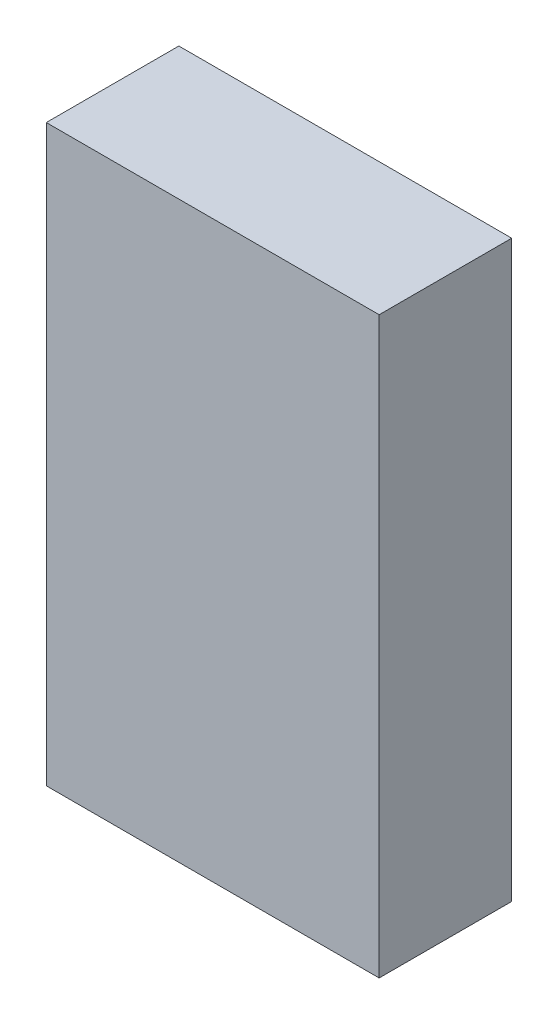
ISO-10303-21;
HEADER;
FILE_DESCRIPTION(('STEP AP214'),'2;1');
FILE_NAME('part.step','',(''),(''),'','','');
FILE_SCHEMA(('AUTOMOTIVE_DESIGN { 1 0 10303 214 1 1 1 1 }'));
ENDSEC;
DATA;
#1=APPLICATION_CONTEXT('core data for automotive mechanical design processes');
#2=APPLICATION_PROTOCOL_DEFINITION('international standard','automotive_design',2000,#1);
#3=PRODUCT_CONTEXT('',#1,'mechanical');
#4=PRODUCT('Part','Part','',(#3));
#5=PRODUCT_RELATED_PRODUCT_CATEGORY('part','',(#4));
#6=PRODUCT_DEFINITION_FORMATION('','',#4);
#7=PRODUCT_DEFINITION_CONTEXT('part definition',#1,'design');
#8=PRODUCT_DEFINITION('design','',#6,#7);
#9=PRODUCT_DEFINITION_SHAPE('','',#8);
#10=(LENGTH_UNIT() NAMED_UNIT(*) SI_UNIT(.MILLI.,.METRE.));
#11=(NAMED_UNIT(*) PLANE_ANGLE_UNIT() SI_UNIT($,.RADIAN.));
#12=(NAMED_UNIT(*) SI_UNIT($,.STERADIAN.) SOLID_ANGLE_UNIT());
#13=UNCERTAINTY_MEASURE_WITH_UNIT(LENGTH_MEASURE(1.E-05),#10,'distance_accuracy_value','');
#14=(GEOMETRIC_REPRESENTATION_CONTEXT(3) GLOBAL_UNCERTAINTY_ASSIGNED_CONTEXT((#13)) GLOBAL_UNIT_ASSIGNED_CONTEXT((#10,
#11,#12)) REPRESENTATION_CONTEXT('',''));
#15=CARTESIAN_POINT('',(0.,0.,0.));
#16=DIRECTION('',(0.,0.,1.));
#17=DIRECTION('',(1.,0.,0.));
#18=AXIS2_PLACEMENT_3D('',#15,#16,#17);
#19=CARTESIAN_POINT('',(565.,975.,450.));
#20=DIRECTION('',(-1.,0.,0.));
#21=DIRECTION('',(0.,-1.,0.));
#22=AXIS2_PLACEMENT_3D('',#19,#20,#21);
#23=PLANE('',#22);
#24=DIRECTION('',(0.,1.,0.));
#25=VECTOR('',#24,1.);
#26=CARTESIAN_POINT('',(565.,975.,0.));
#27=LINE('',#26,#25);
#28=CARTESIAN_POINT('',(565.,-975.,0.));
#29=VERTEX_POINT('',#28);
#30=CARTESIAN_POINT('',(565.,975.,0.));
#31=VERTEX_POINT('',#30);
#32=EDGE_CURVE('E97',#29,#31,#27,.T.);
#33=ORIENTED_EDGE('',*,*,#32,.T.);
#34=DIRECTION('',(0.,0.,-1.));
#35=VECTOR('',#34,1.);
#36=CARTESIAN_POINT('',(565.,975.,450.));
#37=LINE('',#36,#35);
#38=CARTESIAN_POINT('',(565.,975.,450.));
#39=VERTEX_POINT('',#38);
#40=EDGE_CURVE('E11',#39,#31,#37,.T.);
#41=ORIENTED_EDGE('',*,*,#40,.F.);
#42=DIRECTION('',(0.,1.,0.));
#43=VECTOR('',#42,1.);
#44=CARTESIAN_POINT('',(565.,975.,450.));
#45=LINE('',#44,#43);
#46=CARTESIAN_POINT('',(565.,-975.,450.));
#47=VERTEX_POINT('',#46);
#48=EDGE_CURVE('E85',#47,#39,#45,.T.);
#49=ORIENTED_EDGE('',*,*,#48,.F.);
#50=DIRECTION('',(0.,0.,-1.));
#51=VECTOR('',#50,1.);
#52=CARTESIAN_POINT('',(565.,-975.,450.));
#53=LINE('',#52,#51);
#54=EDGE_CURVE('E93',#47,#29,#53,.T.);
#55=ORIENTED_EDGE('',*,*,#54,.T.);
#56=EDGE_LOOP('',(#33,#41,#49,#55));
#57=FACE_BOUND('',#56,.T.);
#58=ADVANCED_FACE('F34',(#57),#23,.F.);
#59=CARTESIAN_POINT('',(-565.,975.,450.));
#60=DIRECTION('',(0.,-1.,0.));
#61=DIRECTION('',(0.,0.,-1.));
#62=AXIS2_PLACEMENT_3D('',#59,#60,#61);
#63=PLANE('',#62);
#64=DIRECTION('',(-1.,0.,0.));
#65=VECTOR('',#64,1.);
#66=CARTESIAN_POINT('',(-565.,975.,0.));
#67=LINE('',#66,#65);
#68=CARTESIAN_POINT('',(-565.,975.,0.));
#69=VERTEX_POINT('',#68);
#70=EDGE_CURVE('E89',#31,#69,#67,.T.);
#71=ORIENTED_EDGE('',*,*,#70,.T.);
#72=DIRECTION('',(0.,0.,-1.));
#73=VECTOR('',#72,1.);
#74=CARTESIAN_POINT('',(-565.,975.,450.));
#75=LINE('',#74,#73);
#76=CARTESIAN_POINT('',(-565.,975.,450.));
#77=VERTEX_POINT('',#76);
#78=EDGE_CURVE('E42',#77,#69,#75,.T.);
#79=ORIENTED_EDGE('',*,*,#78,.F.);
#80=DIRECTION('',(-1.,0.,0.));
#81=VECTOR('',#80,1.);
#82=CARTESIAN_POINT('',(-565.,975.,450.));
#83=LINE('',#82,#81);
#84=EDGE_CURVE('E80',#39,#77,#83,.T.);
#85=ORIENTED_EDGE('',*,*,#84,.F.);
#86=ORIENTED_EDGE('',*,*,#40,.T.);
#87=EDGE_LOOP('',(#71,#79,#85,#86));
#88=FACE_BOUND('',#87,.T.);
#89=ADVANCED_FACE('F88',(#88),#63,.F.);
#90=CARTESIAN_POINT('',(-565.,975.,450.));
#91=DIRECTION('',(1.,0.,0.));
#92=DIRECTION('',(0.,0.,-1.));
#93=AXIS2_PLACEMENT_3D('',#90,#91,#92);
#94=PLANE('',#93);
#95=DIRECTION('',(0.,-1.,0.));
#96=VECTOR('',#95,1.);
#97=CARTESIAN_POINT('',(-565.,975.,0.));
#98=LINE('',#97,#96);
#99=CARTESIAN_POINT('',(-565.,-975.,0.));
#100=VERTEX_POINT('',#99);
#101=EDGE_CURVE('E67',#69,#100,#98,.T.);
#102=ORIENTED_EDGE('',*,*,#101,.T.);
#103=DIRECTION('',(0.,0.,-1.));
#104=VECTOR('',#103,1.);
#105=CARTESIAN_POINT('',(-565.,-975.,450.));
#106=LINE('',#105,#104);
#107=CARTESIAN_POINT('',(-565.,-975.,450.));
#108=VERTEX_POINT('',#107);
#109=EDGE_CURVE('E90',#108,#100,#106,.T.);
#110=ORIENTED_EDGE('',*,*,#109,.F.);
#111=DIRECTION('',(0.,-1.,0.));
#112=VECTOR('',#111,1.);
#113=CARTESIAN_POINT('',(-565.,975.,450.));
#114=LINE('',#113,#112);
#115=EDGE_CURVE('E83',#77,#108,#114,.T.);
#116=ORIENTED_EDGE('',*,*,#115,.F.);
#117=ORIENTED_EDGE('',*,*,#78,.T.);
#118=EDGE_LOOP('',(#102,#110,#116,#117));
#119=FACE_BOUND('',#118,.T.);
#120=ADVANCED_FACE('F91',(#119),#94,.F.);
#121=CARTESIAN_POINT('',(-565.,-975.,450.));
#122=DIRECTION('',(0.,1.,0.));
#123=DIRECTION('',(0.,0.,1.));
#124=AXIS2_PLACEMENT_3D('',#121,#122,#123);
#125=PLANE('',#124);
#126=DIRECTION('',(1.,0.,0.));
#127=VECTOR('',#126,1.);
#128=CARTESIAN_POINT('',(-565.,-975.,0.));
#129=LINE('',#128,#127);
#130=EDGE_CURVE('E73',#100,#29,#129,.T.);
#131=ORIENTED_EDGE('',*,*,#130,.T.);
#132=ORIENTED_EDGE('',*,*,#54,.F.);
#133=DIRECTION('',(1.,0.,0.));
#134=VECTOR('',#133,1.);
#135=CARTESIAN_POINT('',(-565.,-975.,450.));
#136=LINE('',#135,#134);
#137=EDGE_CURVE('E50',#108,#47,#136,.T.);
#138=ORIENTED_EDGE('',*,*,#137,.F.);
#139=ORIENTED_EDGE('',*,*,#109,.T.);
#140=EDGE_LOOP('',(#131,#132,#138,#139));
#141=FACE_BOUND('',#140,.T.);
#142=ADVANCED_FACE('F104',(#141),#125,.F.);
#143=CARTESIAN_POINT('',(0.,0.,450.));
#144=DIRECTION('',(0.,0.,1.));
#145=DIRECTION('',(1.,0.,0.));
#146=AXIS2_PLACEMENT_3D('',#143,#144,#145);
#147=PLANE('',#146);
#148=ORIENTED_EDGE('',*,*,#48,.T.);
#149=ORIENTED_EDGE('',*,*,#84,.T.);
#150=ORIENTED_EDGE('',*,*,#115,.T.);
#151=ORIENTED_EDGE('',*,*,#137,.T.);
#152=EDGE_LOOP('',(#148,#149,#150,#151));
#153=FACE_BOUND('',#152,.T.);
#154=ADVANCED_FACE('F81',(#153),#147,.T.);
#155=CARTESIAN_POINT('',(0.,0.,0.));
#156=DIRECTION('',(0.,0.,1.));
#157=DIRECTION('',(1.,0.,0.));
#158=AXIS2_PLACEMENT_3D('',#155,#156,#157);
#159=PLANE('',#158);
#160=ORIENTED_EDGE('',*,*,#32,.F.);
#161=ORIENTED_EDGE('',*,*,#130,.F.);
#162=ORIENTED_EDGE('',*,*,#101,.F.);
#163=ORIENTED_EDGE('',*,*,#70,.F.);
#164=EDGE_LOOP('',(#160,#161,#162,#163));
#165=FACE_BOUND('',#164,.T.);
#166=ADVANCED_FACE('F107',(#165),#159,.F.);
#167=CLOSED_SHELL('',(#58,#89,#120,#142,#154,#166));
#168=MANIFOLD_SOLID_BREP('B2',#167);
#169=ADVANCED_BREP_SHAPE_REPRESENTATION('',(#18,#168),#14);
#170=SHAPE_DEFINITION_REPRESENTATION(#9,#169);
ENDSEC;
END-ISO-10303-21;
